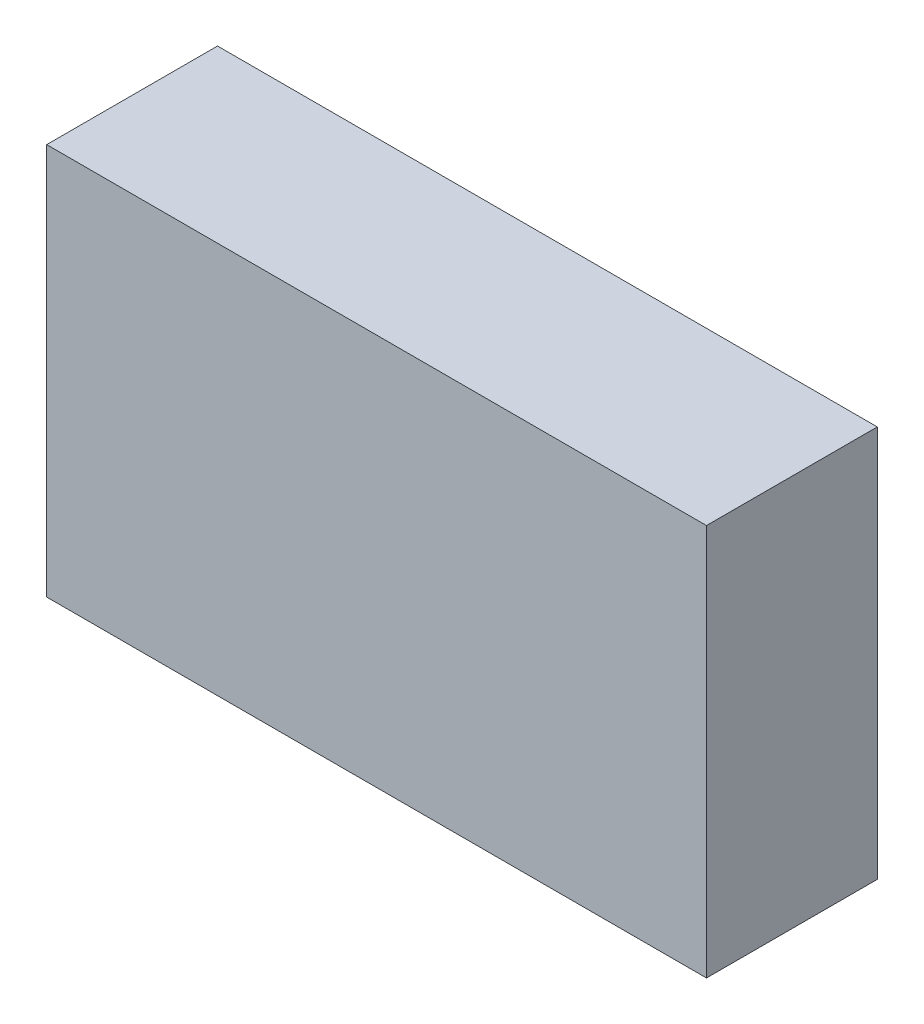
ISO-10303-21;
HEADER;
FILE_DESCRIPTION(('STEP AP214'),'2;1');
FILE_NAME('part.step','',(''),(''),'','','');
FILE_SCHEMA(('AUTOMOTIVE_DESIGN { 1 0 10303 214 1 1 1 1 }'));
ENDSEC;
DATA;
#1=APPLICATION_CONTEXT('core data for automotive mechanical design processes');
#2=APPLICATION_PROTOCOL_DEFINITION('international standard','automotive_design',2000,#1);
#3=PRODUCT_CONTEXT('',#1,'mechanical');
#4=PRODUCT('Part','Part','',(#3));
#5=PRODUCT_RELATED_PRODUCT_CATEGORY('part','',(#4));
#6=PRODUCT_DEFINITION_FORMATION('','',#4);
#7=PRODUCT_DEFINITION_CONTEXT('part definition',#1,'design');
#8=PRODUCT_DEFINITION('design','',#6,#7);
#9=PRODUCT_DEFINITION_SHAPE('','',#8);
#10=(LENGTH_UNIT() NAMED_UNIT(*) SI_UNIT(.MILLI.,.METRE.));
#11=(NAMED_UNIT(*) PLANE_ANGLE_UNIT() SI_UNIT($,.RADIAN.));
#12=(NAMED_UNIT(*) SI_UNIT($,.STERADIAN.) SOLID_ANGLE_UNIT());
#13=UNCERTAINTY_MEASURE_WITH_UNIT(LENGTH_MEASURE(1.E-05),#10,'distance_accuracy_value','');
#14=(GEOMETRIC_REPRESENTATION_CONTEXT(3) GLOBAL_UNCERTAINTY_ASSIGNED_CONTEXT((#13)) GLOBAL_UNIT_ASSIGNED_CONTEXT((#10,
#11,#12)) REPRESENTATION_CONTEXT('',''));
#15=CARTESIAN_POINT('',(0.,0.,0.));
#16=DIRECTION('',(0.,0.,1.));
#17=DIRECTION('',(1.,0.,0.));
#18=AXIS2_PLACEMENT_3D('',#15,#16,#17);
#19=CARTESIAN_POINT('',(0.,0.,5.1));
#20=DIRECTION('',(1.,0.,0.));
#21=DIRECTION('',(0.,0.,-1.));
#22=AXIS2_PLACEMENT_3D('',#19,#20,#21);
#23=PLANE('',#22);
#24=DIRECTION('',(0.,-1.,0.));
#25=VECTOR('',#24,1.);
#26=CARTESIAN_POINT('',(0.,0.,0.));
#27=LINE('',#26,#25);
#28=CARTESIAN_POINT('',(0.,11.7,0.));
#29=VERTEX_POINT('',#28);
#30=CARTESIAN_POINT('',(0.,0.,0.));
#31=VERTEX_POINT('',#30);
#32=EDGE_CURVE('E105',#29,#31,#27,.T.);
#33=ORIENTED_EDGE('',*,*,#32,.T.);
#34=DIRECTION('',(0.,0.,-1.));
#35=VECTOR('',#34,1.);
#36=CARTESIAN_POINT('',(0.,0.,5.1));
#37=LINE('',#36,#35);
#38=CARTESIAN_POINT('',(0.,0.,5.1));
#39=VERTEX_POINT('',#38);
#40=EDGE_CURVE('E11',#39,#31,#37,.T.);
#41=ORIENTED_EDGE('',*,*,#40,.F.);
#42=DIRECTION('',(0.,-1.,0.));
#43=VECTOR('',#42,1.);
#44=CARTESIAN_POINT('',(0.,0.,5.1));
#45=LINE('',#44,#43);
#46=CARTESIAN_POINT('',(0.,11.7,5.1));
#47=VERTEX_POINT('',#46);
#48=EDGE_CURVE('E89',#47,#39,#45,.T.);
#49=ORIENTED_EDGE('',*,*,#48,.F.);
#50=DIRECTION('',(0.,0.,-1.));
#51=VECTOR('',#50,1.);
#52=CARTESIAN_POINT('',(0.,11.7,5.1));
#53=LINE('',#52,#51);
#54=EDGE_CURVE('E97',#47,#29,#53,.T.);
#55=ORIENTED_EDGE('',*,*,#54,.T.);
#56=EDGE_LOOP('',(#33,#41,#49,#55));
#57=FACE_BOUND('',#56,.T.);
#58=ADVANCED_FACE('F39',(#57),#23,.F.);
#59=CARTESIAN_POINT('',(0.,0.,5.1));
#60=DIRECTION('',(0.,1.,0.));
#61=DIRECTION('',(0.,0.,1.));
#62=AXIS2_PLACEMENT_3D('',#59,#60,#61);
#63=PLANE('',#62);
#64=DIRECTION('',(1.,0.,0.));
#65=VECTOR('',#64,1.);
#66=CARTESIAN_POINT('',(0.,0.,0.));
#67=LINE('',#66,#65);
#68=CARTESIAN_POINT('',(19.7,0.,0.));
#69=VERTEX_POINT('',#68);
#70=EDGE_CURVE('E92',#31,#69,#67,.T.);
#71=ORIENTED_EDGE('',*,*,#70,.T.);
#72=DIRECTION('',(0.,0.,-1.));
#73=VECTOR('',#72,1.);
#74=CARTESIAN_POINT('',(19.7,0.,5.1));
#75=LINE('',#74,#73);
#76=CARTESIAN_POINT('',(19.7,0.,5.1));
#77=VERTEX_POINT('',#76);
#78=EDGE_CURVE('E50',#77,#69,#75,.T.);
#79=ORIENTED_EDGE('',*,*,#78,.F.);
#80=DIRECTION('',(1.,0.,0.));
#81=VECTOR('',#80,1.);
#82=CARTESIAN_POINT('',(0.,0.,5.1));
#83=LINE('',#82,#81);
#84=EDGE_CURVE('E82',#39,#77,#83,.T.);
#85=ORIENTED_EDGE('',*,*,#84,.F.);
#86=ORIENTED_EDGE('',*,*,#40,.T.);
#87=EDGE_LOOP('',(#71,#79,#85,#86));
#88=FACE_BOUND('',#87,.T.);
#89=ADVANCED_FACE('F93',(#88),#63,.F.);
#90=CARTESIAN_POINT('',(19.7,0.,5.1));
#91=DIRECTION('',(-1.,0.,0.));
#92=DIRECTION('',(0.,0.,1.));
#93=AXIS2_PLACEMENT_3D('',#90,#91,#92);
#94=PLANE('',#93);
#95=DIRECTION('',(0.,1.,0.));
#96=VECTOR('',#95,1.);
#97=CARTESIAN_POINT('',(19.7,0.,0.));
#98=LINE('',#97,#96);
#99=CARTESIAN_POINT('',(19.7,11.7,0.));
#100=VERTEX_POINT('',#99);
#101=EDGE_CURVE('E72',#69,#100,#98,.T.);
#102=ORIENTED_EDGE('',*,*,#101,.T.);
#103=DIRECTION('',(0.,0.,-1.));
#104=VECTOR('',#103,1.);
#105=CARTESIAN_POINT('',(19.7,11.7,5.1));
#106=LINE('',#105,#104);
#107=CARTESIAN_POINT('',(19.7,11.7,5.1));
#108=VERTEX_POINT('',#107);
#109=EDGE_CURVE('E94',#108,#100,#106,.T.);
#110=ORIENTED_EDGE('',*,*,#109,.F.);
#111=DIRECTION('',(0.,1.,0.));
#112=VECTOR('',#111,1.);
#113=CARTESIAN_POINT('',(19.7,0.,5.1));
#114=LINE('',#113,#112);
#115=EDGE_CURVE('E88',#77,#108,#114,.T.);
#116=ORIENTED_EDGE('',*,*,#115,.F.);
#117=ORIENTED_EDGE('',*,*,#78,.T.);
#118=EDGE_LOOP('',(#102,#110,#116,#117));
#119=FACE_BOUND('',#118,.T.);
#120=ADVANCED_FACE('F96',(#119),#94,.F.);
#121=CARTESIAN_POINT('',(0.,11.7,5.1));
#122=DIRECTION('',(0.,-1.,0.));
#123=DIRECTION('',(0.,0.,-1.));
#124=AXIS2_PLACEMENT_3D('',#121,#122,#123);
#125=PLANE('',#124);
#126=DIRECTION('',(-1.,0.,0.));
#127=VECTOR('',#126,1.);
#128=CARTESIAN_POINT('',(0.,11.7,0.));
#129=LINE('',#128,#127);
#130=EDGE_CURVE('E76',#100,#29,#129,.T.);
#131=ORIENTED_EDGE('',*,*,#130,.T.);
#132=ORIENTED_EDGE('',*,*,#54,.F.);
#133=DIRECTION('',(-1.,0.,0.));
#134=VECTOR('',#133,1.);
#135=CARTESIAN_POINT('',(0.,11.7,5.1));
#136=LINE('',#135,#134);
#137=EDGE_CURVE('E54',#108,#47,#136,.T.);
#138=ORIENTED_EDGE('',*,*,#137,.F.);
#139=ORIENTED_EDGE('',*,*,#109,.T.);
#140=EDGE_LOOP('',(#131,#132,#138,#139));
#141=FACE_BOUND('',#140,.T.);
#142=ADVANCED_FACE('F108',(#141),#125,.F.);
#143=CARTESIAN_POINT('',(0.,0.,5.1));
#144=DIRECTION('',(0.,0.,-1.));
#145=DIRECTION('',(-1.,0.,0.));
#146=AXIS2_PLACEMENT_3D('',#143,#144,#145);
#147=PLANE('',#146);
#148=ORIENTED_EDGE('',*,*,#48,.T.);
#149=ORIENTED_EDGE('',*,*,#84,.T.);
#150=ORIENTED_EDGE('',*,*,#115,.T.);
#151=ORIENTED_EDGE('',*,*,#137,.T.);
#152=EDGE_LOOP('',(#148,#149,#150,#151));
#153=FACE_BOUND('',#152,.T.);
#154=ADVANCED_FACE('F86',(#153),#147,.F.);
#155=CARTESIAN_POINT('',(0.,0.,0.));
#156=DIRECTION('',(0.,0.,-1.));
#157=DIRECTION('',(-1.,0.,0.));
#158=AXIS2_PLACEMENT_3D('',#155,#156,#157);
#159=PLANE('',#158);
#160=ORIENTED_EDGE('',*,*,#32,.F.);
#161=ORIENTED_EDGE('',*,*,#130,.F.);
#162=ORIENTED_EDGE('',*,*,#101,.F.);
#163=ORIENTED_EDGE('',*,*,#70,.F.);
#164=EDGE_LOOP('',(#160,#161,#162,#163));
#165=FACE_BOUND('',#164,.T.);
#166=ADVANCED_FACE('F115',(#165),#159,.T.);
#167=CLOSED_SHELL('',(#58,#89,#120,#142,#154,#166));
#168=MANIFOLD_SOLID_BREP('B2',#167);
#169=ADVANCED_BREP_SHAPE_REPRESENTATION('',(#18,#168),#14);
#170=SHAPE_DEFINITION_REPRESENTATION(#9,#169);
ENDSEC;
END-ISO-10303-21;
